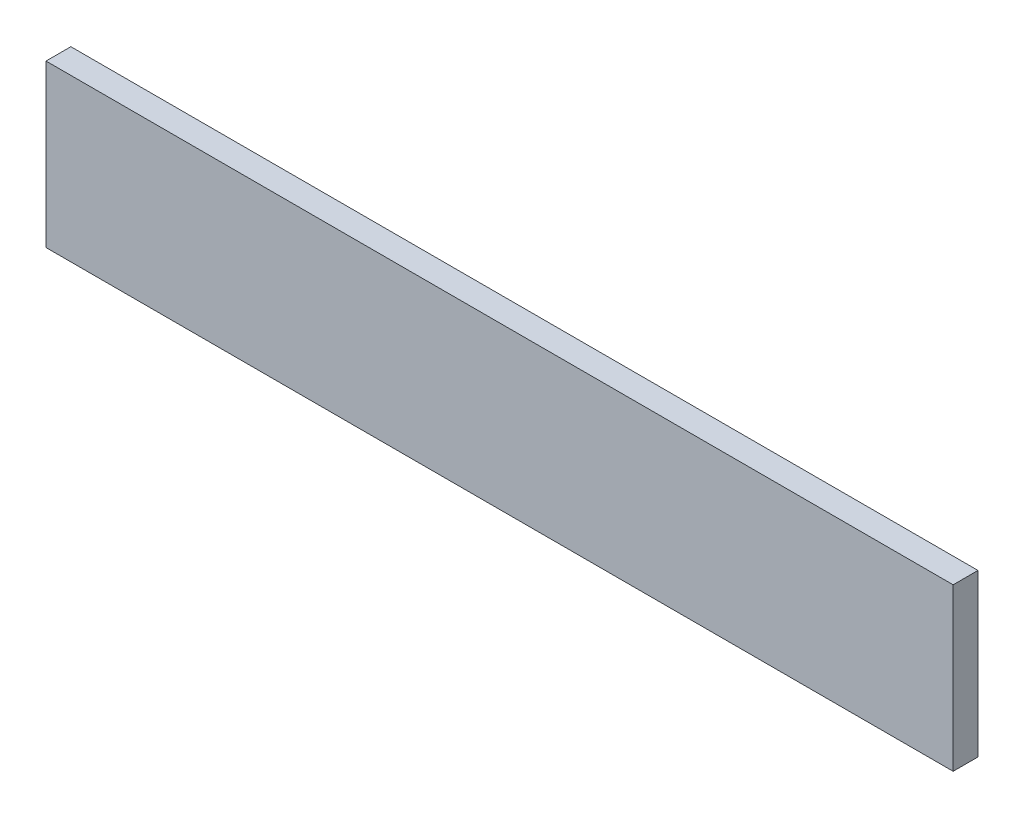
ISO-10303-21;
HEADER;
FILE_DESCRIPTION(('STEP AP214'),'2;1');
FILE_NAME('part.step','',(''),(''),'','','');
FILE_SCHEMA(('AUTOMOTIVE_DESIGN { 1 0 10303 214 1 1 1 1 }'));
ENDSEC;
DATA;
#1=APPLICATION_CONTEXT('core data for automotive mechanical design processes');
#2=APPLICATION_PROTOCOL_DEFINITION('international standard','automotive_design',2000,#1);
#3=PRODUCT_CONTEXT('',#1,'mechanical');
#4=PRODUCT('Part','Part','',(#3));
#5=PRODUCT_RELATED_PRODUCT_CATEGORY('part','',(#4));
#6=PRODUCT_DEFINITION_FORMATION('','',#4);
#7=PRODUCT_DEFINITION_CONTEXT('part definition',#1,'design');
#8=PRODUCT_DEFINITION('design','',#6,#7);
#9=PRODUCT_DEFINITION_SHAPE('','',#8);
#10=(LENGTH_UNIT() NAMED_UNIT(*) SI_UNIT(.MILLI.,.METRE.));
#11=(NAMED_UNIT(*) PLANE_ANGLE_UNIT() SI_UNIT($,.RADIAN.));
#12=(NAMED_UNIT(*) SI_UNIT($,.STERADIAN.) SOLID_ANGLE_UNIT());
#13=UNCERTAINTY_MEASURE_WITH_UNIT(LENGTH_MEASURE(1.E-05),#10,'distance_accuracy_value','');
#14=(GEOMETRIC_REPRESENTATION_CONTEXT(3) GLOBAL_UNCERTAINTY_ASSIGNED_CONTEXT((#13)) GLOBAL_UNIT_ASSIGNED_CONTEXT((#10,
#11,#12)) REPRESENTATION_CONTEXT('',''));
#15=CARTESIAN_POINT('',(0.,0.,0.));
#16=DIRECTION('',(0.,0.,1.));
#17=DIRECTION('',(1.,0.,0.));
#18=AXIS2_PLACEMENT_3D('',#15,#16,#17);
#19=CARTESIAN_POINT('',(-115.8875,-20.6375,3.175));
#20=DIRECTION('',(0.,0.,1.));
#21=DIRECTION('',(1.,0.,0.));
#22=AXIS2_PLACEMENT_3D('',#19,#20,#21);
#23=PLANE('',#22);
#24=DIRECTION('',(0.,-1.,0.));
#25=VECTOR('',#24,1.);
#26=CARTESIAN_POINT('',(-115.8875,20.6375,3.175));
#27=LINE('',#26,#25);
#28=CARTESIAN_POINT('',(-115.8875,20.6375,3.175));
#29=VERTEX_POINT('',#28);
#30=CARTESIAN_POINT('',(-115.8875,-20.6375,3.175));
#31=VERTEX_POINT('',#30);
#32=EDGE_CURVE('E93',#29,#31,#27,.T.);
#33=ORIENTED_EDGE('',*,*,#32,.T.);
#34=DIRECTION('',(1.,0.,0.));
#35=VECTOR('',#34,1.);
#36=CARTESIAN_POINT('',(-115.8875,-20.6375,3.175));
#37=LINE('',#36,#35);
#38=CARTESIAN_POINT('',(115.8875,-20.6375,3.175));
#39=VERTEX_POINT('',#38);
#40=EDGE_CURVE('E89',#31,#39,#37,.T.);
#41=ORIENTED_EDGE('',*,*,#40,.T.);
#42=DIRECTION('',(0.,1.,0.));
#43=VECTOR('',#42,1.);
#44=CARTESIAN_POINT('',(115.8875,20.6375,3.175));
#45=LINE('',#44,#43);
#46=CARTESIAN_POINT('',(115.8875,20.6375,3.175));
#47=VERTEX_POINT('',#46);
#48=EDGE_CURVE('E91',#39,#47,#45,.T.);
#49=ORIENTED_EDGE('',*,*,#48,.T.);
#50=DIRECTION('',(-1.,0.,0.));
#51=VECTOR('',#50,1.);
#52=CARTESIAN_POINT('',(-115.8875,20.6375,3.175));
#53=LINE('',#52,#51);
#54=EDGE_CURVE('E59',#47,#29,#53,.T.);
#55=ORIENTED_EDGE('',*,*,#54,.T.);
#56=EDGE_LOOP('',(#33,#41,#49,#55));
#57=FACE_BOUND('',#56,.T.);
#58=ADVANCED_FACE('F41',(#57),#23,.T.);
#59=CARTESIAN_POINT('',(-115.8875,-20.6375,-3.175));
#60=DIRECTION('',(0.,0.,1.));
#61=DIRECTION('',(1.,0.,0.));
#62=AXIS2_PLACEMENT_3D('',#59,#60,#61);
#63=PLANE('',#62);
#64=DIRECTION('',(0.,-1.,0.));
#65=VECTOR('',#64,1.);
#66=CARTESIAN_POINT('',(-115.8875,20.6375,-3.175));
#67=LINE('',#66,#65);
#68=CARTESIAN_POINT('',(-115.8875,20.6375,-3.175));
#69=VERTEX_POINT('',#68);
#70=CARTESIAN_POINT('',(-115.8875,-20.6375,-3.175));
#71=VERTEX_POINT('',#70);
#72=EDGE_CURVE('E109',#69,#71,#67,.T.);
#73=ORIENTED_EDGE('',*,*,#72,.F.);
#74=DIRECTION('',(-1.,0.,0.));
#75=VECTOR('',#74,1.);
#76=CARTESIAN_POINT('',(-115.8875,20.6375,-3.175));
#77=LINE('',#76,#75);
#78=CARTESIAN_POINT('',(115.8875,20.6375,-3.175));
#79=VERTEX_POINT('',#78);
#80=EDGE_CURVE('E82',#79,#69,#77,.T.);
#81=ORIENTED_EDGE('',*,*,#80,.F.);
#82=DIRECTION('',(0.,1.,0.));
#83=VECTOR('',#82,1.);
#84=CARTESIAN_POINT('',(115.8875,20.6375,-3.175));
#85=LINE('',#84,#83);
#86=CARTESIAN_POINT('',(115.8875,-20.6375,-3.175));
#87=VERTEX_POINT('',#86);
#88=EDGE_CURVE('E76',#87,#79,#85,.T.);
#89=ORIENTED_EDGE('',*,*,#88,.F.);
#90=DIRECTION('',(1.,0.,0.));
#91=VECTOR('',#90,1.);
#92=CARTESIAN_POINT('',(-115.8875,-20.6375,-3.175));
#93=LINE('',#92,#91);
#94=EDGE_CURVE('E98',#71,#87,#93,.T.);
#95=ORIENTED_EDGE('',*,*,#94,.F.);
#96=EDGE_LOOP('',(#73,#81,#89,#95));
#97=FACE_BOUND('',#96,.T.);
#98=ADVANCED_FACE('F125',(#97),#63,.F.);
#99=CARTESIAN_POINT('',(-115.8875,20.6375,3.175));
#100=DIRECTION('',(1.,0.,0.));
#101=DIRECTION('',(0.,1.,0.));
#102=AXIS2_PLACEMENT_3D('',#99,#100,#101);
#103=PLANE('',#102);
#104=ORIENTED_EDGE('',*,*,#72,.T.);
#105=DIRECTION('',(0.,0.,-1.));
#106=VECTOR('',#105,1.);
#107=CARTESIAN_POINT('',(-115.8875,-20.6375,3.175));
#108=LINE('',#107,#106);
#109=EDGE_CURVE('E11',#31,#71,#108,.T.);
#110=ORIENTED_EDGE('',*,*,#109,.F.);
#111=ORIENTED_EDGE('',*,*,#32,.F.);
#112=DIRECTION('',(0.,0.,-1.));
#113=VECTOR('',#112,1.);
#114=CARTESIAN_POINT('',(-115.8875,20.6375,3.175));
#115=LINE('',#114,#113);
#116=EDGE_CURVE('E105',#29,#69,#115,.T.);
#117=ORIENTED_EDGE('',*,*,#116,.T.);
#118=EDGE_LOOP('',(#104,#110,#111,#117));
#119=FACE_BOUND('',#118,.T.);
#120=ADVANCED_FACE('F43',(#119),#103,.F.);
#121=CARTESIAN_POINT('',(-115.8875,-20.6375,3.175));
#122=DIRECTION('',(0.,1.,0.));
#123=DIRECTION('',(0.,0.,1.));
#124=AXIS2_PLACEMENT_3D('',#121,#122,#123);
#125=PLANE('',#124);
#126=ORIENTED_EDGE('',*,*,#94,.T.);
#127=DIRECTION('',(0.,0.,-1.));
#128=VECTOR('',#127,1.);
#129=CARTESIAN_POINT('',(115.8875,-20.6375,3.175));
#130=LINE('',#129,#128);
#131=EDGE_CURVE('E51',#39,#87,#130,.T.);
#132=ORIENTED_EDGE('',*,*,#131,.F.);
#133=ORIENTED_EDGE('',*,*,#40,.F.);
#134=ORIENTED_EDGE('',*,*,#109,.T.);
#135=EDGE_LOOP('',(#126,#132,#133,#134));
#136=FACE_BOUND('',#135,.T.);
#137=ADVANCED_FACE('F97',(#136),#125,.F.);
#138=CARTESIAN_POINT('',(115.8875,20.6375,3.175));
#139=DIRECTION('',(-1.,0.,0.));
#140=DIRECTION('',(0.,-1.,0.));
#141=AXIS2_PLACEMENT_3D('',#138,#139,#140);
#142=PLANE('',#141);
#143=ORIENTED_EDGE('',*,*,#88,.T.);
#144=DIRECTION('',(0.,0.,-1.));
#145=VECTOR('',#144,1.);
#146=CARTESIAN_POINT('',(115.8875,20.6375,3.175));
#147=LINE('',#146,#145);
#148=EDGE_CURVE('E100',#47,#79,#147,.T.);
#149=ORIENTED_EDGE('',*,*,#148,.F.);
#150=ORIENTED_EDGE('',*,*,#48,.F.);
#151=ORIENTED_EDGE('',*,*,#131,.T.);
#152=EDGE_LOOP('',(#143,#149,#150,#151));
#153=FACE_BOUND('',#152,.T.);
#154=ADVANCED_FACE('F101',(#153),#142,.F.);
#155=CARTESIAN_POINT('',(-115.8875,20.6375,3.175));
#156=DIRECTION('',(0.,-1.,0.));
#157=DIRECTION('',(0.,0.,-1.));
#158=AXIS2_PLACEMENT_3D('',#155,#156,#157);
#159=PLANE('',#158);
#160=ORIENTED_EDGE('',*,*,#80,.T.);
#161=ORIENTED_EDGE('',*,*,#116,.F.);
#162=ORIENTED_EDGE('',*,*,#54,.F.);
#163=ORIENTED_EDGE('',*,*,#148,.T.);
#164=EDGE_LOOP('',(#160,#161,#162,#163));
#165=FACE_BOUND('',#164,.T.);
#166=ADVANCED_FACE('F122',(#165),#159,.F.);
#167=CLOSED_SHELL('',(#58,#98,#120,#137,#154,#166));
#168=MANIFOLD_SOLID_BREP('B2',#167);
#169=ADVANCED_BREP_SHAPE_REPRESENTATION('',(#18,#168),#14);
#170=SHAPE_DEFINITION_REPRESENTATION(#9,#169);
ENDSEC;
END-ISO-10303-21;
